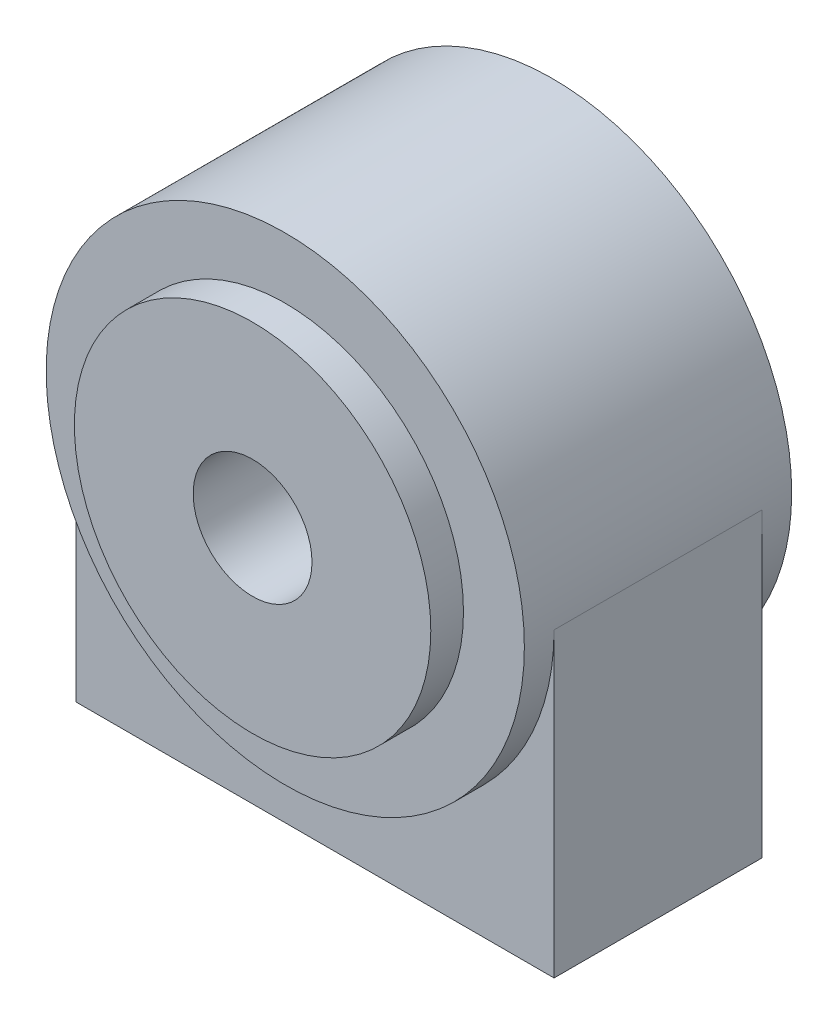
ISO-10303-21;
HEADER;
FILE_DESCRIPTION(('STEP AP214'),'2;1');
FILE_NAME('part.step','',(''),(''),'','','');
FILE_SCHEMA(('AUTOMOTIVE_DESIGN { 1 0 10303 214 1 1 1 1 }'));
ENDSEC;
DATA;
#1=APPLICATION_CONTEXT('core data for automotive mechanical design processes');
#2=APPLICATION_PROTOCOL_DEFINITION('international standard','automotive_design',2000,#1);
#3=PRODUCT_CONTEXT('',#1,'mechanical');
#4=PRODUCT('Part','Part','',(#3));
#5=PRODUCT_RELATED_PRODUCT_CATEGORY('part','',(#4));
#6=PRODUCT_DEFINITION_FORMATION('','',#4);
#7=PRODUCT_DEFINITION_CONTEXT('part definition',#1,'design');
#8=PRODUCT_DEFINITION('design','',#6,#7);
#9=PRODUCT_DEFINITION_SHAPE('','',#8);
#10=(LENGTH_UNIT() NAMED_UNIT(*) SI_UNIT(.MILLI.,.METRE.));
#11=(NAMED_UNIT(*) PLANE_ANGLE_UNIT() SI_UNIT($,.RADIAN.));
#12=(NAMED_UNIT(*) SI_UNIT($,.STERADIAN.) SOLID_ANGLE_UNIT());
#13=UNCERTAINTY_MEASURE_WITH_UNIT(LENGTH_MEASURE(1.E-05),#10,'distance_accuracy_value','');
#14=(GEOMETRIC_REPRESENTATION_CONTEXT(3) GLOBAL_UNCERTAINTY_ASSIGNED_CONTEXT((#13)) GLOBAL_UNIT_ASSIGNED_CONTEXT((#10,
#11,#12)) REPRESENTATION_CONTEXT('',''));
#15=CARTESIAN_POINT('',(0.,0.,0.));
#16=DIRECTION('',(0.,0.,1.));
#17=DIRECTION('',(1.,0.,0.));
#18=AXIS2_PLACEMENT_3D('',#15,#16,#17);
#19=CARTESIAN_POINT('',(-40.25,0.,17.5));
#20=DIRECTION('',(1.,0.,0.));
#21=DIRECTION('',(0.,0.,-1.));
#22=AXIS2_PLACEMENT_3D('',#19,#20,#21);
#23=PLANE('',#22);
#24=DIRECTION('',(0.,-1.,0.));
#25=VECTOR('',#24,1.);
#26=CARTESIAN_POINT('',(-40.25,0.,-17.5));
#27=LINE('',#26,#25);
#28=CARTESIAN_POINT('',(-40.25,50.75,-17.5));
#29=VERTEX_POINT('',#28);
#30=CARTESIAN_POINT('',(-40.25,0.,-17.5));
#31=VERTEX_POINT('',#30);
#32=EDGE_CURVE('E91',#29,#31,#27,.T.);
#33=ORIENTED_EDGE('',*,*,#32,.T.);
#34=DIRECTION('',(0.,0.,-1.));
#35=VECTOR('',#34,1.);
#36=CARTESIAN_POINT('',(-40.25,0.,17.5));
#37=LINE('',#36,#35);
#38=CARTESIAN_POINT('',(-40.25,0.,17.5));
#39=VERTEX_POINT('',#38);
#40=EDGE_CURVE('E92',#39,#31,#37,.T.);
#41=ORIENTED_EDGE('',*,*,#40,.F.);
#42=DIRECTION('',(0.,-1.,0.));
#43=VECTOR('',#42,1.);
#44=CARTESIAN_POINT('',(-40.25,0.,17.5));
#45=LINE('',#44,#43);
#46=CARTESIAN_POINT('',(-40.25,50.75,17.5));
#47=VERTEX_POINT('',#46);
#48=EDGE_CURVE('E94',#47,#39,#45,.T.);
#49=ORIENTED_EDGE('',*,*,#48,.F.);
#50=DIRECTION('',(0.,0.,-1.));
#51=VECTOR('',#50,1.);
#52=CARTESIAN_POINT('',(-40.25,50.75,17.5));
#53=LINE('',#52,#51);
#54=EDGE_CURVE('E83',#47,#29,#53,.T.);
#55=ORIENTED_EDGE('',*,*,#54,.T.);
#56=EDGE_LOOP('',(#33,#41,#49,#55));
#57=FACE_BOUND('',#56,.T.);
#58=ADVANCED_FACE('F35',(#57),#23,.F.);
#59=CARTESIAN_POINT('',(-40.25,0.,17.5));
#60=DIRECTION('',(0.,1.,0.));
#61=DIRECTION('',(0.,0.,1.));
#62=AXIS2_PLACEMENT_3D('',#59,#60,#61);
#63=PLANE('',#62);
#64=DIRECTION('',(1.,0.,0.));
#65=VECTOR('',#64,1.);
#66=CARTESIAN_POINT('',(-40.25,0.,-17.5));
#67=LINE('',#66,#65);
#68=CARTESIAN_POINT('',(40.25,0.,-17.5));
#69=VERTEX_POINT('',#68);
#70=EDGE_CURVE('E63',#31,#69,#67,.T.);
#71=ORIENTED_EDGE('',*,*,#70,.T.);
#72=DIRECTION('',(0.,0.,-1.));
#73=VECTOR('',#72,1.);
#74=CARTESIAN_POINT('',(40.25,0.,17.5));
#75=LINE('',#74,#73);
#76=CARTESIAN_POINT('',(40.25,0.,17.5));
#77=VERTEX_POINT('',#76);
#78=EDGE_CURVE('E82',#77,#69,#75,.T.);
#79=ORIENTED_EDGE('',*,*,#78,.F.);
#80=DIRECTION('',(1.,0.,0.));
#81=VECTOR('',#80,1.);
#82=CARTESIAN_POINT('',(-40.25,0.,17.5));
#83=LINE('',#82,#81);
#84=EDGE_CURVE('E51',#39,#77,#83,.T.);
#85=ORIENTED_EDGE('',*,*,#84,.F.);
#86=ORIENTED_EDGE('',*,*,#40,.T.);
#87=EDGE_LOOP('',(#71,#79,#85,#86));
#88=FACE_BOUND('',#87,.T.);
#89=ADVANCED_FACE('F104',(#88),#63,.F.);
#90=CARTESIAN_POINT('',(40.25,0.,17.5));
#91=DIRECTION('',(-1.,0.,0.));
#92=DIRECTION('',(0.,0.,1.));
#93=AXIS2_PLACEMENT_3D('',#90,#91,#92);
#94=PLANE('',#93);
#95=DIRECTION('',(0.,1.,0.));
#96=VECTOR('',#95,1.);
#97=CARTESIAN_POINT('',(40.25,0.,-17.5));
#98=LINE('',#97,#96);
#99=CARTESIAN_POINT('',(40.25,50.75,-17.5));
#100=VERTEX_POINT('',#99);
#101=EDGE_CURVE('E89',#69,#100,#98,.T.);
#102=ORIENTED_EDGE('',*,*,#101,.T.);
#103=DIRECTION('',(0.,0.,-1.));
#104=VECTOR('',#103,1.);
#105=CARTESIAN_POINT('',(40.25,50.75,17.5));
#106=LINE('',#105,#104);
#107=CARTESIAN_POINT('',(40.25,50.75,17.5));
#108=VERTEX_POINT('',#107);
#109=EDGE_CURVE('E70',#108,#100,#106,.T.);
#110=ORIENTED_EDGE('',*,*,#109,.F.);
#111=DIRECTION('',(0.,1.,0.));
#112=VECTOR('',#111,1.);
#113=CARTESIAN_POINT('',(40.25,0.,17.5));
#114=LINE('',#113,#112);
#115=EDGE_CURVE('E100',#77,#108,#114,.T.);
#116=ORIENTED_EDGE('',*,*,#115,.F.);
#117=ORIENTED_EDGE('',*,*,#78,.T.);
#118=EDGE_LOOP('',(#102,#110,#116,#117));
#119=FACE_BOUND('',#118,.T.);
#120=ADVANCED_FACE('F93',(#119),#94,.F.);
#121=CARTESIAN_POINT('',(0.,0.,17.5));
#122=DIRECTION('',(0.,0.,-1.));
#123=DIRECTION('',(-1.,0.,0.));
#124=AXIS2_PLACEMENT_3D('',#121,#122,#123);
#125=PLANE('',#124);
#126=CARTESIAN_POINT('',(0.,50.75,17.5));
#127=DIRECTION('',(0.,0.,-1.));
#128=DIRECTION('',(-1.,0.,0.));
#129=AXIS2_PLACEMENT_3D('',#126,#127,#128);
#130=CIRCLE('',#129,40.25);
#131=EDGE_CURVE('E78',#47,#108,#130,.F.);
#132=ORIENTED_EDGE('',*,*,#131,.F.);
#133=ORIENTED_EDGE('',*,*,#48,.T.);
#134=ORIENTED_EDGE('',*,*,#84,.T.);
#135=ORIENTED_EDGE('',*,*,#115,.T.);
#136=EDGE_LOOP('',(#132,#133,#134,#135));
#137=FACE_BOUND('',#136,.T.);
#138=ADVANCED_FACE('F161',(#137),#125,.F.);
#139=CARTESIAN_POINT('',(0.,0.,-17.5));
#140=DIRECTION('',(0.,0.,-1.));
#141=DIRECTION('',(-1.,0.,0.));
#142=AXIS2_PLACEMENT_3D('',#139,#140,#141);
#143=PLANE('',#142);
#144=ORIENTED_EDGE('',*,*,#32,.F.);
#145=CARTESIAN_POINT('',(0.,50.75,-17.5));
#146=DIRECTION('',(0.,0.,-1.));
#147=DIRECTION('',(-1.,0.,0.));
#148=AXIS2_PLACEMENT_3D('',#145,#146,#147);
#149=CIRCLE('',#148,40.25);
#150=EDGE_CURVE('E43',#29,#100,#149,.F.);
#151=ORIENTED_EDGE('',*,*,#150,.T.);
#152=ORIENTED_EDGE('',*,*,#101,.F.);
#153=ORIENTED_EDGE('',*,*,#70,.F.);
#154=EDGE_LOOP('',(#144,#151,#152,#153));
#155=FACE_BOUND('',#154,.T.);
#156=ADVANCED_FACE('F88',(#155),#143,.T.);
#157=CARTESIAN_POINT('',(0.,50.75,22.5));
#158=DIRECTION('',(0.,0.,-1.));
#159=DIRECTION('',(-1.,0.,0.));
#160=AXIS2_PLACEMENT_3D('',#157,#158,#159);
#161=CYLINDRICAL_SURFACE('',#160,40.25);
#162=CARTESIAN_POINT('',(0.,50.75,22.5));
#163=DIRECTION('',(0.,0.,1.));
#164=DIRECTION('',(1.,0.,0.));
#165=AXIS2_PLACEMENT_3D('',#162,#163,#164);
#166=CIRCLE('',#165,40.25);
#167=CARTESIAN_POINT('',(40.25,50.75,22.5));
#168=VERTEX_POINT('',#167);
#169=EDGE_CURVE('E107',#168,#168,#166,.T.);
#170=ORIENTED_EDGE('',*,*,#169,.F.);
#171=EDGE_LOOP('',(#170));
#172=FACE_BOUND('',#171,.T.);
#173=CARTESIAN_POINT('',(0.,50.75,-22.5));
#174=DIRECTION('',(0.,0.,1.));
#175=DIRECTION('',(1.,0.,0.));
#176=AXIS2_PLACEMENT_3D('',#173,#174,#175);
#177=CIRCLE('',#176,40.25);
#178=CARTESIAN_POINT('',(40.25,50.75,-22.5));
#179=VERTEX_POINT('',#178);
#180=EDGE_CURVE('E112',#179,#179,#177,.T.);
#181=ORIENTED_EDGE('',*,*,#180,.T.);
#182=EDGE_LOOP('',(#181));
#183=FACE_BOUND('',#182,.T.);
#184=ORIENTED_EDGE('',*,*,#54,.F.);
#185=ORIENTED_EDGE('',*,*,#131,.T.);
#186=ORIENTED_EDGE('',*,*,#109,.T.);
#187=ORIENTED_EDGE('',*,*,#150,.F.);
#188=EDGE_LOOP('',(#184,#185,#186,#187));
#189=FACE_BOUND('',#188,.T.);
#190=ADVANCED_FACE('F73',(#172,#183,#189),#161,.T.);
#191=CARTESIAN_POINT('',(0.,50.75,22.5));
#192=DIRECTION('',(0.,0.,1.));
#193=DIRECTION('',(1.,0.,0.));
#194=AXIS2_PLACEMENT_3D('',#191,#192,#193);
#195=PLANE('',#194);
#196=CARTESIAN_POINT('',(0.,50.75,22.5));
#197=DIRECTION('',(0.,0.,1.));
#198=DIRECTION('',(1.,0.,0.));
#199=AXIS2_PLACEMENT_3D('',#196,#197,#198);
#200=CIRCLE('',#199,30.);
#201=CARTESIAN_POINT('',(30.,50.75,22.5));
#202=VERTEX_POINT('',#201);
#203=EDGE_CURVE('E115',#202,#202,#200,.F.);
#204=ORIENTED_EDGE('',*,*,#203,.T.);
#205=EDGE_LOOP('',(#204));
#206=FACE_BOUND('',#205,.T.);
#207=ORIENTED_EDGE('',*,*,#169,.T.);
#208=EDGE_LOOP('',(#207));
#209=FACE_BOUND('',#208,.T.);
#210=ADVANCED_FACE('F170',(#206,#209),#195,.T.);
#211=CARTESIAN_POINT('',(0.,50.75,-22.5));
#212=DIRECTION('',(0.,0.,1.));
#213=DIRECTION('',(1.,0.,0.));
#214=AXIS2_PLACEMENT_3D('',#211,#212,#213);
#215=PLANE('',#214);
#216=CARTESIAN_POINT('',(0.,50.75,-22.5));
#217=DIRECTION('',(0.,0.,1.));
#218=DIRECTION('',(1.,0.,0.));
#219=AXIS2_PLACEMENT_3D('',#216,#217,#218);
#220=CIRCLE('',#219,30.);
#221=CARTESIAN_POINT('',(30.,50.75,-22.5));
#222=VERTEX_POINT('',#221);
#223=EDGE_CURVE('E11',#222,#222,#220,.F.);
#224=ORIENTED_EDGE('',*,*,#223,.F.);
#225=EDGE_LOOP('',(#224));
#226=FACE_BOUND('',#225,.T.);
#227=ORIENTED_EDGE('',*,*,#180,.F.);
#228=EDGE_LOOP('',(#227));
#229=FACE_BOUND('',#228,.T.);
#230=ADVANCED_FACE('F172',(#226,#229),#215,.F.);
#231=CARTESIAN_POINT('',(0.,50.75,-28.));
#232=DIRECTION('',(0.,0.,1.));
#233=DIRECTION('',(1.,0.,0.));
#234=AXIS2_PLACEMENT_3D('',#231,#232,#233);
#235=PLANE('',#234);
#236=CARTESIAN_POINT('',(0.,50.75,-28.));
#237=DIRECTION('',(0.,0.,1.));
#238=DIRECTION('',(1.,0.,0.));
#239=AXIS2_PLACEMENT_3D('',#236,#237,#238);
#240=CIRCLE('',#239,10.);
#241=CARTESIAN_POINT('',(10.,50.75,-28.));
#242=VERTEX_POINT('',#241);
#243=EDGE_CURVE('E124',#242,#242,#240,.T.);
#244=ORIENTED_EDGE('',*,*,#243,.T.);
#245=EDGE_LOOP('',(#244));
#246=FACE_BOUND('',#245,.T.);
#247=CARTESIAN_POINT('',(0.,50.75,-28.));
#248=DIRECTION('',(0.,0.,1.));
#249=DIRECTION('',(1.,0.,0.));
#250=AXIS2_PLACEMENT_3D('',#247,#248,#249);
#251=CIRCLE('',#250,30.);
#252=CARTESIAN_POINT('',(30.,50.75,-28.));
#253=VERTEX_POINT('',#252);
#254=EDGE_CURVE('E121',#253,#253,#251,.T.);
#255=ORIENTED_EDGE('',*,*,#254,.F.);
#256=EDGE_LOOP('',(#255));
#257=FACE_BOUND('',#256,.T.);
#258=ADVANCED_FACE('F149',(#246,#257),#235,.F.);
#259=CARTESIAN_POINT('',(0.,50.75,28.));
#260=DIRECTION('',(0.,0.,-1.));
#261=DIRECTION('',(-1.,0.,0.));
#262=AXIS2_PLACEMENT_3D('',#259,#260,#261);
#263=CYLINDRICAL_SURFACE('',#262,30.);
#264=ORIENTED_EDGE('',*,*,#254,.T.);
#265=EDGE_LOOP('',(#264));
#266=FACE_BOUND('',#265,.T.);
#267=ORIENTED_EDGE('',*,*,#223,.T.);
#268=EDGE_LOOP('',(#267));
#269=FACE_BOUND('',#268,.T.);
#270=ADVANCED_FACE('F143',(#266,#269),#263,.T.);
#271=ORIENTED_EDGE('',*,*,#203,.F.);
#272=EDGE_LOOP('',(#271));
#273=FACE_BOUND('',#272,.T.);
#274=CARTESIAN_POINT('',(0.,50.75,28.));
#275=DIRECTION('',(0.,0.,1.));
#276=DIRECTION('',(1.,0.,0.));
#277=AXIS2_PLACEMENT_3D('',#274,#275,#276);
#278=CIRCLE('',#277,30.);
#279=CARTESIAN_POINT('',(30.,50.75,28.));
#280=VERTEX_POINT('',#279);
#281=EDGE_CURVE('E120',#280,#280,#278,.T.);
#282=ORIENTED_EDGE('',*,*,#281,.F.);
#283=EDGE_LOOP('',(#282));
#284=FACE_BOUND('',#283,.T.);
#285=ADVANCED_FACE('F138',(#273,#284),#263,.T.);
#286=CARTESIAN_POINT('',(0.,50.75,28.));
#287=DIRECTION('',(0.,0.,1.));
#288=DIRECTION('',(1.,0.,0.));
#289=AXIS2_PLACEMENT_3D('',#286,#287,#288);
#290=PLANE('',#289);
#291=CARTESIAN_POINT('',(0.,50.75,28.));
#292=DIRECTION('',(0.,0.,1.));
#293=DIRECTION('',(1.,0.,0.));
#294=AXIS2_PLACEMENT_3D('',#291,#292,#293);
#295=CIRCLE('',#294,10.);
#296=CARTESIAN_POINT('',(10.,50.75,28.));
#297=VERTEX_POINT('',#296);
#298=EDGE_CURVE('E129',#297,#297,#295,.T.);
#299=ORIENTED_EDGE('',*,*,#298,.F.);
#300=EDGE_LOOP('',(#299));
#301=FACE_BOUND('',#300,.T.);
#302=ORIENTED_EDGE('',*,*,#281,.T.);
#303=EDGE_LOOP('',(#302));
#304=FACE_BOUND('',#303,.T.);
#305=ADVANCED_FACE('F135',(#301,#304),#290,.T.);
#306=CARTESIAN_POINT('',(0.,50.75,-28.));
#307=DIRECTION('',(0.,0.,1.));
#308=DIRECTION('',(1.,0.,0.));
#309=AXIS2_PLACEMENT_3D('',#306,#307,#308);
#310=CYLINDRICAL_SURFACE('',#309,10.);
#311=ORIENTED_EDGE('',*,*,#243,.F.);
#312=EDGE_LOOP('',(#311));
#313=FACE_BOUND('',#312,.T.);
#314=ORIENTED_EDGE('',*,*,#298,.T.);
#315=EDGE_LOOP('',(#314));
#316=FACE_BOUND('',#315,.T.);
#317=ADVANCED_FACE('F133',(#313,#316),#310,.F.);
#318=CLOSED_SHELL('',(#58,#89,#120,#138,#156,#190,#210,#230,#258,#270,#285,#305,#317));
#319=MANIFOLD_SOLID_BREP('B2',#318);
#320=ADVANCED_BREP_SHAPE_REPRESENTATION('',(#18,#319),#14);
#321=SHAPE_DEFINITION_REPRESENTATION(#9,#320);
ENDSEC;
END-ISO-10303-21;
